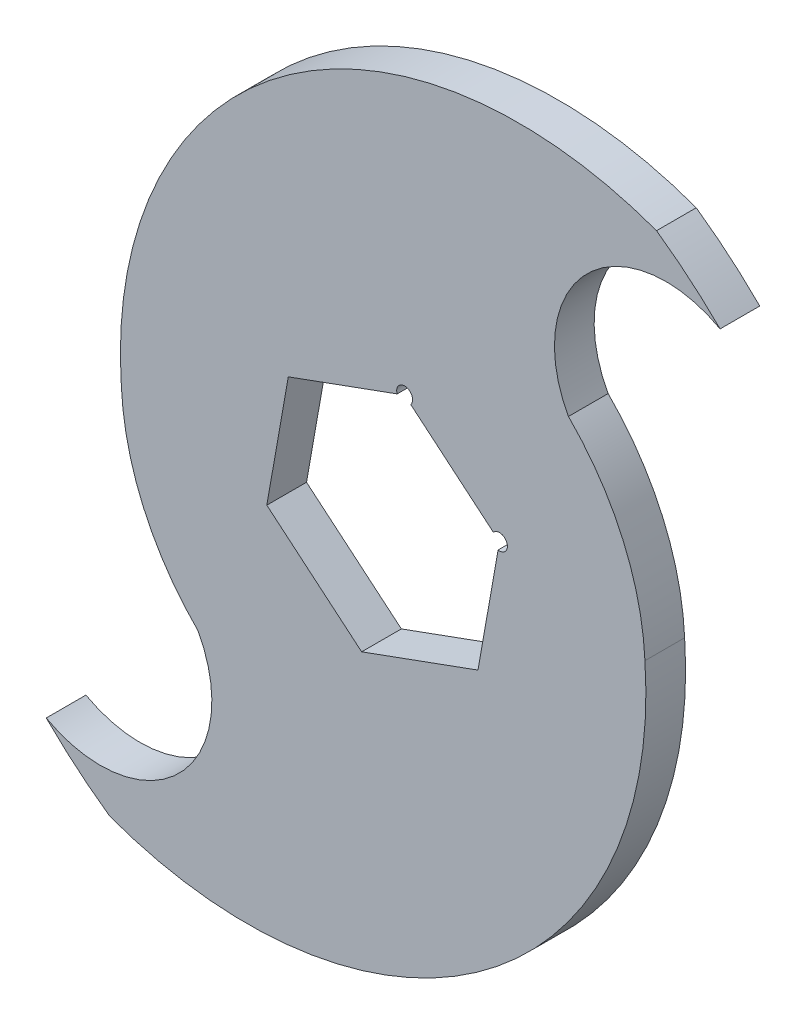
ISO-10303-21;
HEADER;
FILE_DESCRIPTION(('STEP AP214'),'2;1');
FILE_NAME('part.step','',(''),(''),'','','');
FILE_SCHEMA(('AUTOMOTIVE_DESIGN { 1 0 10303 214 1 1 1 1 }'));
ENDSEC;
DATA;
#1=APPLICATION_CONTEXT('core data for automotive mechanical design processes');
#2=APPLICATION_PROTOCOL_DEFINITION('international standard','automotive_design',2000,#1);
#3=PRODUCT_CONTEXT('',#1,'mechanical');
#4=PRODUCT('Part','Part','',(#3));
#5=PRODUCT_RELATED_PRODUCT_CATEGORY('part','',(#4));
#6=PRODUCT_DEFINITION_FORMATION('','',#4);
#7=PRODUCT_DEFINITION_CONTEXT('part definition',#1,'design');
#8=PRODUCT_DEFINITION('design','',#6,#7);
#9=PRODUCT_DEFINITION_SHAPE('','',#8);
#10=(LENGTH_UNIT() NAMED_UNIT(*) SI_UNIT(.MILLI.,.METRE.));
#11=(NAMED_UNIT(*) PLANE_ANGLE_UNIT() SI_UNIT($,.RADIAN.));
#12=(NAMED_UNIT(*) SI_UNIT($,.STERADIAN.) SOLID_ANGLE_UNIT());
#13=UNCERTAINTY_MEASURE_WITH_UNIT(LENGTH_MEASURE(1.E-05),#10,'distance_accuracy_value','');
#14=(GEOMETRIC_REPRESENTATION_CONTEXT(3) GLOBAL_UNCERTAINTY_ASSIGNED_CONTEXT((#13)) GLOBAL_UNIT_ASSIGNED_CONTEXT((#10,
#11,#12)) REPRESENTATION_CONTEXT('',''));
#15=CARTESIAN_POINT('',(0.,0.,0.));
#16=DIRECTION('',(0.,0.,1.));
#17=DIRECTION('',(1.,0.,0.));
#18=AXIS2_PLACEMENT_3D('',#15,#16,#17);
#19=CARTESIAN_POINT('',(692.036784045136,67.0737170226357,2.5));
#20=DIRECTION('',(0.,0.,1.));
#21=DIRECTION('',(1.,0.,0.));
#22=AXIS2_PLACEMENT_3D('',#19,#20,#21);
#23=PLANE('',#22);
#24=CARTESIAN_POINT('',(683.473593132399,66.0736019880736,2.5));
#25=DIRECTION('',(0.,0.,1.));
#26=DIRECTION('',(1.,0.,0.));
#27=AXIS2_PLACEMENT_3D('',#24,#25,#26);
#28=CIRCLE('',#27,60.0000000001002);
#29=CARTESIAN_POINT('',(725.900000003706,108.500008859301,2.5));
#30=VERTEX_POINT('',#29);
#31=CARTESIAN_POINT('',(717.900029607308,115.214424851049,2.5));
#32=VERTEX_POINT('',#31);
#33=EDGE_CURVE('E211',#30,#32,#28,.T.);
#34=ORIENTED_EDGE('',*,*,#33,.T.);
#35=CARTESIAN_POINT('',(700.599974957873,68.0738320571978,2.5));
#36=DIRECTION('',(0.,0.,1.));
#37=DIRECTION('',(1.,0.,0.));
#38=AXIS2_PLACEMENT_3D('',#35,#36,#37);
#39=CIRCLE('',#38,50.2148123548139);
#40=CARTESIAN_POINT('',(650.508452339022,64.5571942375947,2.5));
#41=VERTEX_POINT('',#40);
#42=EDGE_CURVE('E214',#32,#41,#39,.T.);
#43=ORIENTED_EDGE('',*,*,#42,.T.);
#44=CARTESIAN_POINT('',(683.473593132399,66.0736019880736,2.5));
#45=DIRECTION('',(0.,0.,1.));
#46=DIRECTION('',(1.,0.,0.));
#47=AXIS2_PLACEMENT_3D('',#44,#45,#46);
#48=CIRCLE('',#47,32.9999999998919);
#49=CARTESIAN_POINT('',(660.139069353336,42.7390782089767,2.5));
#50=VERTEX_POINT('',#49);
#51=EDGE_CURVE('E217',#41,#50,#48,.T.);
#52=ORIENTED_EDGE('',*,*,#51,.T.);
#53=CARTESIAN_POINT('',(647.863663292967,35.9226011772968,2.5));
#54=DIRECTION('',(0.,0.,-1.));
#55=DIRECTION('',(1.,0.,0.));
#56=AXIS2_PLACEMENT_3D('',#53,#54,#55);
#57=CIRCLE('',#56,14.041009688422);
#58=CARTESIAN_POINT('',(641.047186261298,23.647195116922,2.5));
#59=VERTEX_POINT('',#58);
#60=EDGE_CURVE('E219',#50,#59,#57,.T.);
#61=ORIENTED_EDGE('',*,*,#60,.T.);
#62=CARTESIAN_POINT('',(683.473593132399,66.0736019880736,2.5));
#63=DIRECTION('',(0.,0.,1.));
#64=DIRECTION('',(1.,0.,0.));
#65=AXIS2_PLACEMENT_3D('',#62,#63,#64);
#66=CIRCLE('',#65,59.9999999999218);
#67=CARTESIAN_POINT('',(649.047156657725,16.9327791251433,2.5));
#68=VERTEX_POINT('',#67);
#69=EDGE_CURVE('E221',#59,#68,#66,.T.);
#70=ORIENTED_EDGE('',*,*,#69,.T.);
#71=CARTESIAN_POINT('',(666.347211307088,64.07337191901,2.5));
#72=DIRECTION('',(0.,0.,1.));
#73=DIRECTION('',(1.,0.,0.));
#74=AXIS2_PLACEMENT_3D('',#71,#72,#73);
#75=CIRCLE('',#74,50.2148123548191);
#76=CARTESIAN_POINT('',(716.438733925939,67.5900097386882,2.5));
#77=VERTEX_POINT('',#76);
#78=EDGE_CURVE('E223',#68,#77,#75,.T.);
#79=ORIENTED_EDGE('',*,*,#78,.T.);
#80=CARTESIAN_POINT('',(683.473593132399,66.0736019880736,2.5));
#81=DIRECTION('',(0.,0.,1.));
#82=DIRECTION('',(1.,0.,0.));
#83=AXIS2_PLACEMENT_3D('',#80,#81,#82);
#84=CIRCLE('',#83,33.0000000000743);
#85=CARTESIAN_POINT('',(706.808116911639,89.4081257672507,2.5));
#86=VERTEX_POINT('',#85);
#87=EDGE_CURVE('E225',#77,#86,#84,.T.);
#88=ORIENTED_EDGE('',*,*,#87,.T.);
#89=CARTESIAN_POINT('',(719.083522971964,96.2246027989907,2.5));
#90=DIRECTION('',(0.,0.,-1.));
#91=DIRECTION('',(1.,0.,0.));
#92=AXIS2_PLACEMENT_3D('',#89,#90,#91);
#93=CIRCLE('',#92,14.0410096884012);
#94=EDGE_CURVE('E227',#86,#30,#93,.T.);
#95=ORIENTED_EDGE('',*,*,#94,.T.);
#96=EDGE_LOOP('',(#34,#43,#52,#61,#70,#79,#88,#95));
#97=FACE_BOUND('',#96,.T.);
#98=DIRECTION('',(-0.939692620786663,-0.342020143323595,0.));
#99=VECTOR('',#98,1.);
#100=CARTESIAN_POINT('',(685.24080770889,81.0832154198808,2.5));
#101=LINE('',#100,#99);
#102=CARTESIAN_POINT('',(685.24080770889,81.0832154198808,2.5));
#103=VERTEX_POINT('',#102);
#104=CARTESIAN_POINT('',(671.532142065476,76.0936691742048,2.5));
#105=VERTEX_POINT('',#104);
#106=EDGE_CURVE('E154',#103,#105,#101,.T.);
#107=ORIENTED_EDGE('',*,*,#106,.F.);
#108=CARTESIAN_POINT('',(686.180500329676,81.4252355632047,2.5));
#109=DIRECTION('',(0.,0.,1.));
#110=DIRECTION('',(1.,0.,0.));
#111=AXIS2_PLACEMENT_3D('',#108,#109,#110);
#112=CIRCLE('',#111,0.999999999999972);
#113=CARTESIAN_POINT('',(686.946544772799,80.7824479535236,2.5));
#114=VERTEX_POINT('',#113);
#115=EDGE_CURVE('E146',#114,#103,#112,.T.);
#116=ORIENTED_EDGE('',*,*,#115,.F.);
#117=DIRECTION('',(-0.766044443122853,0.642787609681921,0.));
#118=VECTOR('',#117,1.);
#119=CARTESIAN_POINT('',(697.355906953653,72.047955986886,2.5));
#120=LINE('',#119,#118);
#121=CARTESIAN_POINT('',(697.355906953653,72.047955986886,2.5));
#122=VERTEX_POINT('',#121);
#123=EDGE_CURVE('E179',#122,#114,#120,.T.);
#124=ORIENTED_EDGE('',*,*,#123,.F.);
#125=CARTESIAN_POINT('',(698.121951396781,71.4051683772103,2.5));
#126=DIRECTION('',(0.,0.,1.));
#127=DIRECTION('',(1.,0.,0.));
#128=AXIS2_PLACEMENT_3D('',#125,#126,#127);
#129=CIRCLE('',#128,1.00000000000004);
#130=CARTESIAN_POINT('',(697.948303219076,70.4203606242047,2.5));
#131=VERTEX_POINT('',#130);
#132=EDGE_CURVE('E177',#131,#122,#129,.T.);
#133=ORIENTED_EDGE('',*,*,#132,.F.);
#134=DIRECTION('',(0.173648177667407,0.984807753012124,0.));
#135=VECTOR('',#134,1.);
#136=CARTESIAN_POINT('',(695.415044199476,56.0535348020048,2.5));
#137=LINE('',#136,#135);
#138=CARTESIAN_POINT('',(695.415044199476,56.0535348020048,2.5));
#139=VERTEX_POINT('',#138);
#140=EDGE_CURVE('E175',#139,#131,#137,.T.);
#141=ORIENTED_EDGE('',*,*,#140,.F.);
#142=DIRECTION('',(0.939692620786653,0.342020143323622,0.));
#143=VECTOR('',#142,1.);
#144=CARTESIAN_POINT('',(680.766685935276,50.7219684130048,2.5));
#145=LINE('',#144,#143);
#146=CARTESIAN_POINT('',(680.766685935276,50.7219684130048,2.5));
#147=VERTEX_POINT('',#146);
#148=EDGE_CURVE('E173',#147,#139,#145,.T.);
#149=ORIENTED_EDGE('',*,*,#148,.F.);
#150=DIRECTION('',(0.766044443122931,-0.642787609681828,0.));
#151=VECTOR('',#150,1.);
#152=CARTESIAN_POINT('',(668.825234868176,60.7420355990048,2.5));
#153=LINE('',#152,#151);
#154=CARTESIAN_POINT('',(668.825234868176,60.7420355990048,2.5));
#155=VERTEX_POINT('',#154);
#156=EDGE_CURVE('E169',#155,#147,#153,.T.);
#157=ORIENTED_EDGE('',*,*,#156,.F.);
#158=DIRECTION('',(-0.173648177669557,-0.984807753011745,0.));
#159=VECTOR('',#158,1.);
#160=CARTESIAN_POINT('',(671.532142065476,76.0936691742048,2.5));
#161=LINE('',#160,#159);
#162=EDGE_CURVE('E167',#105,#155,#161,.T.);
#163=ORIENTED_EDGE('',*,*,#162,.F.);
#164=EDGE_LOOP('',(#107,#116,#124,#133,#141,#149,#157,#163));
#165=FACE_BOUND('',#164,.T.);
#166=ADVANCED_FACE('F33',(#97,#165),#23,.T.);
#167=CARTESIAN_POINT('',(692.036784045136,67.0737170226357,-2.5));
#168=DIRECTION('',(0.,0.,1.));
#169=DIRECTION('',(1.,0.,0.));
#170=AXIS2_PLACEMENT_3D('',#167,#168,#169);
#171=PLANE('',#170);
#172=CARTESIAN_POINT('',(683.473593132399,66.0736019880736,-2.5));
#173=DIRECTION('',(0.,0.,1.));
#174=DIRECTION('',(1.,0.,0.));
#175=AXIS2_PLACEMENT_3D('',#172,#173,#174);
#176=CIRCLE('',#175,60.0000000001002);
#177=CARTESIAN_POINT('',(725.900000003706,108.500008859301,-2.5));
#178=VERTEX_POINT('',#177);
#179=CARTESIAN_POINT('',(717.900029607308,115.214424851049,-2.5));
#180=VERTEX_POINT('',#179);
#181=EDGE_CURVE('E162',#178,#180,#176,.T.);
#182=ORIENTED_EDGE('',*,*,#181,.F.);
#183=CARTESIAN_POINT('',(719.083522971964,96.2246027989907,-2.5));
#184=DIRECTION('',(0.,0.,-1.));
#185=DIRECTION('',(1.,0.,0.));
#186=AXIS2_PLACEMENT_3D('',#183,#184,#185);
#187=CIRCLE('',#186,14.0410096884012);
#188=CARTESIAN_POINT('',(706.808116911639,89.4081257672507,-2.5));
#189=VERTEX_POINT('',#188);
#190=EDGE_CURVE('E215',#189,#178,#187,.T.);
#191=ORIENTED_EDGE('',*,*,#190,.F.);
#192=CARTESIAN_POINT('',(683.473593132399,66.0736019880736,-2.5));
#193=DIRECTION('',(0.,0.,1.));
#194=DIRECTION('',(1.,0.,0.));
#195=AXIS2_PLACEMENT_3D('',#192,#193,#194);
#196=CIRCLE('',#195,33.0000000000743);
#197=CARTESIAN_POINT('',(716.438733925939,67.5900097386882,-2.5));
#198=VERTEX_POINT('',#197);
#199=EDGE_CURVE('E242',#198,#189,#196,.T.);
#200=ORIENTED_EDGE('',*,*,#199,.F.);
#201=CARTESIAN_POINT('',(666.347211307088,64.07337191901,-2.5));
#202=DIRECTION('',(0.,0.,1.));
#203=DIRECTION('',(1.,0.,0.));
#204=AXIS2_PLACEMENT_3D('',#201,#202,#203);
#205=CIRCLE('',#204,50.2148123548191);
#206=CARTESIAN_POINT('',(649.047156657725,16.9327791251433,-2.5));
#207=VERTEX_POINT('',#206);
#208=EDGE_CURVE('E240',#207,#198,#205,.T.);
#209=ORIENTED_EDGE('',*,*,#208,.F.);
#210=CARTESIAN_POINT('',(683.473593132399,66.0736019880736,-2.5));
#211=DIRECTION('',(0.,0.,1.));
#212=DIRECTION('',(1.,0.,0.));
#213=AXIS2_PLACEMENT_3D('',#210,#211,#212);
#214=CIRCLE('',#213,59.9999999999218);
#215=CARTESIAN_POINT('',(641.047186261298,23.647195116922,-2.5));
#216=VERTEX_POINT('',#215);
#217=EDGE_CURVE('E238',#216,#207,#214,.T.);
#218=ORIENTED_EDGE('',*,*,#217,.F.);
#219=CARTESIAN_POINT('',(647.863663292967,35.9226011772968,-2.5));
#220=DIRECTION('',(0.,0.,-1.));
#221=DIRECTION('',(1.,0.,0.));
#222=AXIS2_PLACEMENT_3D('',#219,#220,#221);
#223=CIRCLE('',#222,14.041009688422);
#224=CARTESIAN_POINT('',(660.139069353336,42.7390782089767,-2.5));
#225=VERTEX_POINT('',#224);
#226=EDGE_CURVE('E236',#225,#216,#223,.T.);
#227=ORIENTED_EDGE('',*,*,#226,.F.);
#228=CARTESIAN_POINT('',(683.473593132399,66.0736019880736,-2.5));
#229=DIRECTION('',(0.,0.,1.));
#230=DIRECTION('',(1.,0.,0.));
#231=AXIS2_PLACEMENT_3D('',#228,#229,#230);
#232=CIRCLE('',#231,32.9999999998919);
#233=CARTESIAN_POINT('',(650.508452339022,64.5571942375947,-2.5));
#234=VERTEX_POINT('',#233);
#235=EDGE_CURVE('E234',#234,#225,#232,.T.);
#236=ORIENTED_EDGE('',*,*,#235,.F.);
#237=CARTESIAN_POINT('',(700.599974957873,68.0738320571978,-2.5));
#238=DIRECTION('',(0.,0.,1.));
#239=DIRECTION('',(1.,0.,0.));
#240=AXIS2_PLACEMENT_3D('',#237,#238,#239);
#241=CIRCLE('',#240,50.2148123548139);
#242=EDGE_CURVE('E232',#180,#234,#241,.T.);
#243=ORIENTED_EDGE('',*,*,#242,.F.);
#244=EDGE_LOOP('',(#182,#191,#200,#209,#218,#227,#236,#243));
#245=FACE_BOUND('',#244,.T.);
#246=CARTESIAN_POINT('',(686.180500329676,81.4252355632047,-2.5));
#247=DIRECTION('',(0.,0.,1.));
#248=DIRECTION('',(1.,0.,0.));
#249=AXIS2_PLACEMENT_3D('',#246,#247,#248);
#250=CIRCLE('',#249,0.999999999999972);
#251=CARTESIAN_POINT('',(686.946544772799,80.7824479535236,-2.5));
#252=VERTEX_POINT('',#251);
#253=CARTESIAN_POINT('',(685.24080770889,81.0832154198808,-2.5));
#254=VERTEX_POINT('',#253);
#255=EDGE_CURVE('E56',#252,#254,#250,.T.);
#256=ORIENTED_EDGE('',*,*,#255,.T.);
#257=DIRECTION('',(-0.939692620786663,-0.342020143323595,0.));
#258=VECTOR('',#257,1.);
#259=CARTESIAN_POINT('',(685.24080770889,81.0832154198808,-2.5));
#260=LINE('',#259,#258);
#261=CARTESIAN_POINT('',(671.532142065476,76.0936691742048,-2.5));
#262=VERTEX_POINT('',#261);
#263=EDGE_CURVE('E161',#254,#262,#260,.T.);
#264=ORIENTED_EDGE('',*,*,#263,.T.);
#265=DIRECTION('',(-0.173648177669557,-0.984807753011745,0.));
#266=VECTOR('',#265,1.);
#267=CARTESIAN_POINT('',(671.532142065476,76.0936691742048,-2.5));
#268=LINE('',#267,#266);
#269=CARTESIAN_POINT('',(668.825234868176,60.7420355990048,-2.5));
#270=VERTEX_POINT('',#269);
#271=EDGE_CURVE('E183',#262,#270,#268,.T.);
#272=ORIENTED_EDGE('',*,*,#271,.T.);
#273=DIRECTION('',(0.766044443122931,-0.642787609681828,0.));
#274=VECTOR('',#273,1.);
#275=CARTESIAN_POINT('',(668.825234868176,60.7420355990048,-2.5));
#276=LINE('',#275,#274);
#277=CARTESIAN_POINT('',(680.766685935276,50.7219684130048,-2.5));
#278=VERTEX_POINT('',#277);
#279=EDGE_CURVE('E186',#270,#278,#276,.T.);
#280=ORIENTED_EDGE('',*,*,#279,.T.);
#281=DIRECTION('',(0.939692620786653,0.342020143323622,0.));
#282=VECTOR('',#281,1.);
#283=CARTESIAN_POINT('',(680.766685935276,50.7219684130048,-2.5));
#284=LINE('',#283,#282);
#285=CARTESIAN_POINT('',(695.415044199476,56.0535348020048,-2.5));
#286=VERTEX_POINT('',#285);
#287=EDGE_CURVE('E189',#278,#286,#284,.T.);
#288=ORIENTED_EDGE('',*,*,#287,.T.);
#289=DIRECTION('',(0.173648177667407,0.984807753012124,0.));
#290=VECTOR('',#289,1.);
#291=CARTESIAN_POINT('',(695.415044199476,56.0535348020048,-2.5));
#292=LINE('',#291,#290);
#293=CARTESIAN_POINT('',(697.948303219076,70.4203606242047,-2.5));
#294=VERTEX_POINT('',#293);
#295=EDGE_CURVE('E192',#286,#294,#292,.T.);
#296=ORIENTED_EDGE('',*,*,#295,.T.);
#297=CARTESIAN_POINT('',(698.121951396781,71.4051683772103,-2.5));
#298=DIRECTION('',(0.,0.,1.));
#299=DIRECTION('',(1.,0.,0.));
#300=AXIS2_PLACEMENT_3D('',#297,#298,#299);
#301=CIRCLE('',#300,1.00000000000004);
#302=CARTESIAN_POINT('',(697.355906953653,72.047955986886,-2.5));
#303=VERTEX_POINT('',#302);
#304=EDGE_CURVE('E195',#294,#303,#301,.T.);
#305=ORIENTED_EDGE('',*,*,#304,.T.);
#306=DIRECTION('',(-0.766044443122853,0.642787609681921,0.));
#307=VECTOR('',#306,1.);
#308=CARTESIAN_POINT('',(697.355906953653,72.047955986886,-2.5));
#309=LINE('',#308,#307);
#310=EDGE_CURVE('E155',#303,#252,#309,.T.);
#311=ORIENTED_EDGE('',*,*,#310,.T.);
#312=EDGE_LOOP('',(#256,#264,#272,#280,#288,#296,#305,#311));
#313=FACE_BOUND('',#312,.T.);
#314=ADVANCED_FACE('F272',(#245,#313),#171,.F.);
#315=CARTESIAN_POINT('',(683.473593132399,66.0736019880736,2.5));
#316=DIRECTION('',(0.,0.,-1.));
#317=DIRECTION('',(-1.,0.,0.));
#318=AXIS2_PLACEMENT_3D('',#315,#316,#317);
#319=CYLINDRICAL_SURFACE('',#318,60.0000000001002);
#320=ORIENTED_EDGE('',*,*,#181,.T.);
#321=DIRECTION('',(0.,0.,-1.));
#322=VECTOR('',#321,1.);
#323=CARTESIAN_POINT('',(717.900029607308,115.214424851049,2.5));
#324=LINE('',#323,#322);
#325=EDGE_CURVE('E11',#32,#180,#324,.T.);
#326=ORIENTED_EDGE('',*,*,#325,.F.);
#327=ORIENTED_EDGE('',*,*,#33,.F.);
#328=DIRECTION('',(0.,0.,-1.));
#329=VECTOR('',#328,1.);
#330=CARTESIAN_POINT('',(725.900000003706,108.500008859301,2.5));
#331=LINE('',#330,#329);
#332=EDGE_CURVE('E229',#30,#178,#331,.T.);
#333=ORIENTED_EDGE('',*,*,#332,.T.);
#334=EDGE_LOOP('',(#320,#326,#327,#333));
#335=FACE_BOUND('',#334,.T.);
#336=ADVANCED_FACE('F35',(#335),#319,.T.);
#337=CARTESIAN_POINT('',(700.599974957873,68.0738320571978,2.5));
#338=DIRECTION('',(0.,0.,-1.));
#339=DIRECTION('',(-1.,0.,0.));
#340=AXIS2_PLACEMENT_3D('',#337,#338,#339);
#341=CYLINDRICAL_SURFACE('',#340,50.2148123548139);
#342=ORIENTED_EDGE('',*,*,#242,.T.);
#343=DIRECTION('',(0.,0.,-1.));
#344=VECTOR('',#343,1.);
#345=CARTESIAN_POINT('',(650.508452339022,64.5571942375947,2.5));
#346=LINE('',#345,#344);
#347=EDGE_CURVE('E41',#41,#234,#346,.T.);
#348=ORIENTED_EDGE('',*,*,#347,.F.);
#349=ORIENTED_EDGE('',*,*,#42,.F.);
#350=ORIENTED_EDGE('',*,*,#325,.T.);
#351=EDGE_LOOP('',(#342,#348,#349,#350));
#352=FACE_BOUND('',#351,.T.);
#353=ADVANCED_FACE('F289',(#352),#341,.T.);
#354=CARTESIAN_POINT('',(683.473593132399,66.0736019880736,2.5));
#355=DIRECTION('',(0.,0.,-1.));
#356=DIRECTION('',(-1.,0.,0.));
#357=AXIS2_PLACEMENT_3D('',#354,#355,#356);
#358=CYLINDRICAL_SURFACE('',#357,32.9999999998919);
#359=ORIENTED_EDGE('',*,*,#235,.T.);
#360=DIRECTION('',(0.,0.,-1.));
#361=VECTOR('',#360,1.);
#362=CARTESIAN_POINT('',(660.139069353336,42.7390782089767,2.5));
#363=LINE('',#362,#361);
#364=EDGE_CURVE('E259',#50,#225,#363,.T.);
#365=ORIENTED_EDGE('',*,*,#364,.F.);
#366=ORIENTED_EDGE('',*,*,#51,.F.);
#367=ORIENTED_EDGE('',*,*,#347,.T.);
#368=EDGE_LOOP('',(#359,#365,#366,#367));
#369=FACE_BOUND('',#368,.T.);
#370=ADVANCED_FACE('F266',(#369),#358,.T.);
#371=CARTESIAN_POINT('',(647.863663292967,35.9226011772968,2.5));
#372=DIRECTION('',(0.,0.,-1.));
#373=DIRECTION('',(-1.,0.,0.));
#374=AXIS2_PLACEMENT_3D('',#371,#372,#373);
#375=CYLINDRICAL_SURFACE('',#374,14.041009688422);
#376=ORIENTED_EDGE('',*,*,#226,.T.);
#377=DIRECTION('',(0.,0.,-1.));
#378=VECTOR('',#377,1.);
#379=CARTESIAN_POINT('',(641.047186261298,23.647195116922,2.5));
#380=LINE('',#379,#378);
#381=EDGE_CURVE('E256',#59,#216,#380,.T.);
#382=ORIENTED_EDGE('',*,*,#381,.F.);
#383=ORIENTED_EDGE('',*,*,#60,.F.);
#384=ORIENTED_EDGE('',*,*,#364,.T.);
#385=EDGE_LOOP('',(#376,#382,#383,#384));
#386=FACE_BOUND('',#385,.T.);
#387=ADVANCED_FACE('F278',(#386),#375,.F.);
#388=CARTESIAN_POINT('',(683.473593132399,66.0736019880736,2.5));
#389=DIRECTION('',(0.,0.,-1.));
#390=DIRECTION('',(-1.,0.,0.));
#391=AXIS2_PLACEMENT_3D('',#388,#389,#390);
#392=CYLINDRICAL_SURFACE('',#391,59.9999999999218);
#393=ORIENTED_EDGE('',*,*,#217,.T.);
#394=DIRECTION('',(0.,0.,-1.));
#395=VECTOR('',#394,1.);
#396=CARTESIAN_POINT('',(649.047156657725,16.9327791251433,2.5));
#397=LINE('',#396,#395);
#398=EDGE_CURVE('E253',#68,#207,#397,.T.);
#399=ORIENTED_EDGE('',*,*,#398,.F.);
#400=ORIENTED_EDGE('',*,*,#69,.F.);
#401=ORIENTED_EDGE('',*,*,#381,.T.);
#402=EDGE_LOOP('',(#393,#399,#400,#401));
#403=FACE_BOUND('',#402,.T.);
#404=ADVANCED_FACE('F282',(#403),#392,.T.);
#405=CARTESIAN_POINT('',(666.347211307088,64.07337191901,2.5));
#406=DIRECTION('',(0.,0.,-1.));
#407=DIRECTION('',(-1.,0.,0.));
#408=AXIS2_PLACEMENT_3D('',#405,#406,#407);
#409=CYLINDRICAL_SURFACE('',#408,50.2148123548191);
#410=ORIENTED_EDGE('',*,*,#208,.T.);
#411=DIRECTION('',(0.,0.,-1.));
#412=VECTOR('',#411,1.);
#413=CARTESIAN_POINT('',(716.438733925939,67.5900097386882,2.5));
#414=LINE('',#413,#412);
#415=EDGE_CURVE('E250',#77,#198,#414,.T.);
#416=ORIENTED_EDGE('',*,*,#415,.F.);
#417=ORIENTED_EDGE('',*,*,#78,.F.);
#418=ORIENTED_EDGE('',*,*,#398,.T.);
#419=EDGE_LOOP('',(#410,#416,#417,#418));
#420=FACE_BOUND('',#419,.T.);
#421=ADVANCED_FACE('F302',(#420),#409,.T.);
#422=CARTESIAN_POINT('',(683.473593132399,66.0736019880736,2.5));
#423=DIRECTION('',(0.,0.,-1.));
#424=DIRECTION('',(-1.,0.,0.));
#425=AXIS2_PLACEMENT_3D('',#422,#423,#424);
#426=CYLINDRICAL_SURFACE('',#425,33.0000000000743);
#427=ORIENTED_EDGE('',*,*,#199,.T.);
#428=DIRECTION('',(0.,0.,-1.));
#429=VECTOR('',#428,1.);
#430=CARTESIAN_POINT('',(706.808116911639,89.4081257672507,2.5));
#431=LINE('',#430,#429);
#432=EDGE_CURVE('E247',#86,#189,#431,.T.);
#433=ORIENTED_EDGE('',*,*,#432,.F.);
#434=ORIENTED_EDGE('',*,*,#87,.F.);
#435=ORIENTED_EDGE('',*,*,#415,.T.);
#436=EDGE_LOOP('',(#427,#433,#434,#435));
#437=FACE_BOUND('',#436,.T.);
#438=ADVANCED_FACE('F300',(#437),#426,.T.);
#439=CARTESIAN_POINT('',(719.083522971964,96.2246027989907,2.5));
#440=DIRECTION('',(0.,0.,-1.));
#441=DIRECTION('',(-1.,0.,0.));
#442=AXIS2_PLACEMENT_3D('',#439,#440,#441);
#443=CYLINDRICAL_SURFACE('',#442,14.0410096884012);
#444=ORIENTED_EDGE('',*,*,#190,.T.);
#445=ORIENTED_EDGE('',*,*,#332,.F.);
#446=ORIENTED_EDGE('',*,*,#94,.F.);
#447=ORIENTED_EDGE('',*,*,#432,.T.);
#448=EDGE_LOOP('',(#444,#445,#446,#447));
#449=FACE_BOUND('',#448,.T.);
#450=ADVANCED_FACE('F295',(#449),#443,.F.);
#451=CARTESIAN_POINT('',(686.180500329676,81.4252355632047,2.5));
#452=DIRECTION('',(0.,0.,-1.));
#453=DIRECTION('',(-1.,0.,0.));
#454=AXIS2_PLACEMENT_3D('',#451,#452,#453);
#455=CYLINDRICAL_SURFACE('',#454,0.999999999999972);
#456=ORIENTED_EDGE('',*,*,#255,.F.);
#457=DIRECTION('',(0.,0.,-1.));
#458=VECTOR('',#457,1.);
#459=CARTESIAN_POINT('',(686.946544772799,80.7824479535236,2.5));
#460=LINE('',#459,#458);
#461=EDGE_CURVE('E150',#114,#252,#460,.T.);
#462=ORIENTED_EDGE('',*,*,#461,.F.);
#463=ORIENTED_EDGE('',*,*,#115,.T.);
#464=DIRECTION('',(0.,0.,-1.));
#465=VECTOR('',#464,1.);
#466=CARTESIAN_POINT('',(685.24080770889,81.0832154198808,2.5));
#467=LINE('',#466,#465);
#468=EDGE_CURVE('E149',#103,#254,#467,.T.);
#469=ORIENTED_EDGE('',*,*,#468,.T.);
#470=EDGE_LOOP('',(#456,#462,#463,#469));
#471=FACE_BOUND('',#470,.T.);
#472=ADVANCED_FACE('F148',(#471),#455,.F.);
#473=CARTESIAN_POINT('',(685.24080770889,81.0832154198808,2.5));
#474=DIRECTION('',(0.342020143323595,-0.939692620786663,0.));
#475=DIRECTION('',(0.939692620786663,0.342020143323595,0.));
#476=AXIS2_PLACEMENT_3D('',#473,#474,#475);
#477=PLANE('',#476);
#478=ORIENTED_EDGE('',*,*,#263,.F.);
#479=ORIENTED_EDGE('',*,*,#468,.F.);
#480=ORIENTED_EDGE('',*,*,#106,.T.);
#481=DIRECTION('',(0.,0.,-1.));
#482=VECTOR('',#481,1.);
#483=CARTESIAN_POINT('',(671.532142065476,76.0936691742048,2.5));
#484=LINE('',#483,#482);
#485=EDGE_CURVE('E163',#105,#262,#484,.T.);
#486=ORIENTED_EDGE('',*,*,#485,.T.);
#487=EDGE_LOOP('',(#478,#479,#480,#486));
#488=FACE_BOUND('',#487,.T.);
#489=ADVANCED_FACE('F158',(#488),#477,.T.);
#490=CARTESIAN_POINT('',(671.532142065476,76.0936691742048,2.5));
#491=DIRECTION('',(0.984807753011745,-0.173648177669557,0.));
#492=DIRECTION('',(0.173648177669557,0.984807753011745,0.));
#493=AXIS2_PLACEMENT_3D('',#490,#491,#492);
#494=PLANE('',#493);
#495=ORIENTED_EDGE('',*,*,#271,.F.);
#496=ORIENTED_EDGE('',*,*,#485,.F.);
#497=ORIENTED_EDGE('',*,*,#162,.T.);
#498=DIRECTION('',(0.,0.,-1.));
#499=VECTOR('',#498,1.);
#500=CARTESIAN_POINT('',(668.825234868176,60.7420355990048,2.5));
#501=LINE('',#500,#499);
#502=EDGE_CURVE('E208',#155,#270,#501,.T.);
#503=ORIENTED_EDGE('',*,*,#502,.T.);
#504=EDGE_LOOP('',(#495,#496,#497,#503));
#505=FACE_BOUND('',#504,.T.);
#506=ADVANCED_FACE('F327',(#505),#494,.T.);
#507=CARTESIAN_POINT('',(668.825234868176,60.7420355990048,2.5));
#508=DIRECTION('',(0.642787609681828,0.766044443122931,0.));
#509=DIRECTION('',(-0.766044443122931,0.642787609681828,0.));
#510=AXIS2_PLACEMENT_3D('',#507,#508,#509);
#511=PLANE('',#510);
#512=ORIENTED_EDGE('',*,*,#279,.F.);
#513=ORIENTED_EDGE('',*,*,#502,.F.);
#514=ORIENTED_EDGE('',*,*,#156,.T.);
#515=DIRECTION('',(0.,0.,-1.));
#516=VECTOR('',#515,1.);
#517=CARTESIAN_POINT('',(680.766685935276,50.7219684130048,2.5));
#518=LINE('',#517,#516);
#519=EDGE_CURVE('E206',#147,#278,#518,.T.);
#520=ORIENTED_EDGE('',*,*,#519,.T.);
#521=EDGE_LOOP('',(#512,#513,#514,#520));
#522=FACE_BOUND('',#521,.T.);
#523=ADVANCED_FACE('F331',(#522),#511,.T.);
#524=CARTESIAN_POINT('',(680.766685935276,50.7219684130048,2.5));
#525=DIRECTION('',(-0.342020143323622,0.939692620786653,0.));
#526=DIRECTION('',(-0.939692620786653,-0.342020143323622,0.));
#527=AXIS2_PLACEMENT_3D('',#524,#525,#526);
#528=PLANE('',#527);
#529=ORIENTED_EDGE('',*,*,#287,.F.);
#530=ORIENTED_EDGE('',*,*,#519,.F.);
#531=ORIENTED_EDGE('',*,*,#148,.T.);
#532=DIRECTION('',(0.,0.,-1.));
#533=VECTOR('',#532,1.);
#534=CARTESIAN_POINT('',(695.415044199476,56.0535348020048,2.5));
#535=LINE('',#534,#533);
#536=EDGE_CURVE('E204',#139,#286,#535,.T.);
#537=ORIENTED_EDGE('',*,*,#536,.T.);
#538=EDGE_LOOP('',(#529,#530,#531,#537));
#539=FACE_BOUND('',#538,.T.);
#540=ADVANCED_FACE('F337',(#539),#528,.T.);
#541=CARTESIAN_POINT('',(695.415044199476,56.0535348020048,2.5));
#542=DIRECTION('',(-0.984807753012124,0.173648177667407,0.));
#543=DIRECTION('',(-0.173648177667407,-0.984807753012124,0.));
#544=AXIS2_PLACEMENT_3D('',#541,#542,#543);
#545=PLANE('',#544);
#546=ORIENTED_EDGE('',*,*,#295,.F.);
#547=ORIENTED_EDGE('',*,*,#536,.F.);
#548=ORIENTED_EDGE('',*,*,#140,.T.);
#549=DIRECTION('',(0.,0.,-1.));
#550=VECTOR('',#549,1.);
#551=CARTESIAN_POINT('',(697.948303219076,70.4203606242047,2.5));
#552=LINE('',#551,#550);
#553=EDGE_CURVE('E202',#131,#294,#552,.T.);
#554=ORIENTED_EDGE('',*,*,#553,.T.);
#555=EDGE_LOOP('',(#546,#547,#548,#554));
#556=FACE_BOUND('',#555,.T.);
#557=ADVANCED_FACE('F341',(#556),#545,.T.);
#558=CARTESIAN_POINT('',(698.121951396781,71.4051683772103,2.5));
#559=DIRECTION('',(0.,0.,-1.));
#560=DIRECTION('',(-1.,0.,0.));
#561=AXIS2_PLACEMENT_3D('',#558,#559,#560);
#562=CYLINDRICAL_SURFACE('',#561,1.00000000000004);
#563=ORIENTED_EDGE('',*,*,#304,.F.);
#564=ORIENTED_EDGE('',*,*,#553,.F.);
#565=ORIENTED_EDGE('',*,*,#132,.T.);
#566=DIRECTION('',(0.,0.,-1.));
#567=VECTOR('',#566,1.);
#568=CARTESIAN_POINT('',(697.355906953653,72.047955986886,2.5));
#569=LINE('',#568,#567);
#570=EDGE_CURVE('E48',#122,#303,#569,.T.);
#571=ORIENTED_EDGE('',*,*,#570,.T.);
#572=EDGE_LOOP('',(#563,#564,#565,#571));
#573=FACE_BOUND('',#572,.T.);
#574=ADVANCED_FACE('F345',(#573),#562,.F.);
#575=CARTESIAN_POINT('',(697.355906953653,72.047955986886,2.5));
#576=DIRECTION('',(-0.642787609681921,-0.766044443122853,0.));
#577=DIRECTION('',(0.766044443122853,-0.642787609681921,0.));
#578=AXIS2_PLACEMENT_3D('',#575,#576,#577);
#579=PLANE('',#578);
#580=ORIENTED_EDGE('',*,*,#310,.F.);
#581=ORIENTED_EDGE('',*,*,#570,.F.);
#582=ORIENTED_EDGE('',*,*,#123,.T.);
#583=ORIENTED_EDGE('',*,*,#461,.T.);
#584=EDGE_LOOP('',(#580,#581,#582,#583));
#585=FACE_BOUND('',#584,.T.);
#586=ADVANCED_FACE('F349',(#585),#579,.T.);
#587=CLOSED_SHELL('',(#166,#314,#336,#353,#370,#387,#404,#421,#438,#450,#472,#489,#506,#523,
#540,#557,#574,#586));
#588=MANIFOLD_SOLID_BREP('B2',#587);
#589=ADVANCED_BREP_SHAPE_REPRESENTATION('',(#18,#588),#14);
#590=SHAPE_DEFINITION_REPRESENTATION(#9,#589);
ENDSEC;
END-ISO-10303-21;
